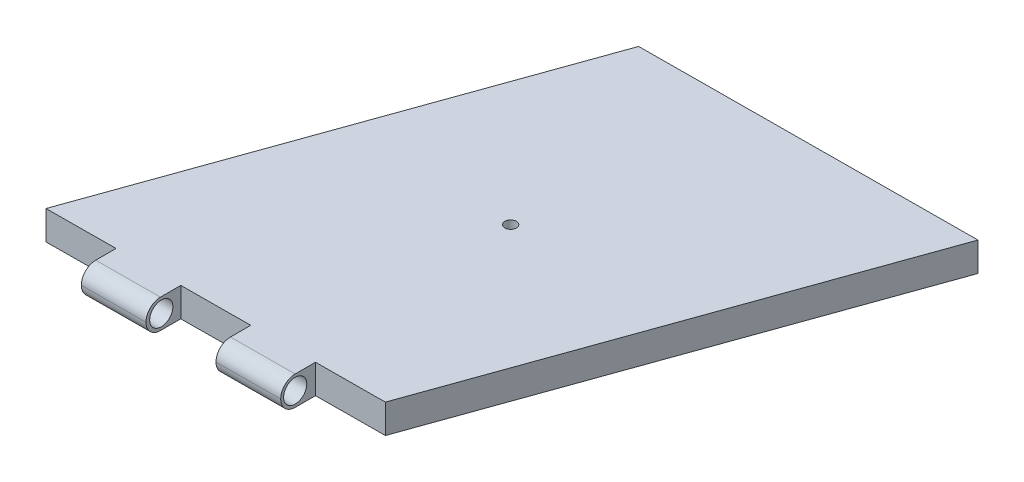
ISO-10303-21;
HEADER;
FILE_DESCRIPTION(('STEP AP214'),'2;1');
FILE_NAME('part.step','',(''),(''),'','','');
FILE_SCHEMA(('AUTOMOTIVE_DESIGN { 1 0 10303 214 1 1 1 1 }'));
ENDSEC;
DATA;
#1=APPLICATION_CONTEXT('core data for automotive mechanical design processes');
#2=APPLICATION_PROTOCOL_DEFINITION('international standard','automotive_design',2000,#1);
#3=PRODUCT_CONTEXT('',#1,'mechanical');
#4=PRODUCT('Part','Part','',(#3));
#5=PRODUCT_RELATED_PRODUCT_CATEGORY('part','',(#4));
#6=PRODUCT_DEFINITION_FORMATION('','',#4);
#7=PRODUCT_DEFINITION_CONTEXT('part definition',#1,'design');
#8=PRODUCT_DEFINITION('design','',#6,#7);
#9=PRODUCT_DEFINITION_SHAPE('','',#8);
#10=(LENGTH_UNIT() NAMED_UNIT(*) SI_UNIT(.MILLI.,.METRE.));
#11=(NAMED_UNIT(*) PLANE_ANGLE_UNIT() SI_UNIT($,.RADIAN.));
#12=(NAMED_UNIT(*) SI_UNIT($,.STERADIAN.) SOLID_ANGLE_UNIT());
#13=UNCERTAINTY_MEASURE_WITH_UNIT(LENGTH_MEASURE(1.E-05),#10,'distance_accuracy_value','');
#14=(GEOMETRIC_REPRESENTATION_CONTEXT(3) GLOBAL_UNCERTAINTY_ASSIGNED_CONTEXT((#13)) GLOBAL_UNIT_ASSIGNED_CONTEXT((#10,
#11,#12)) REPRESENTATION_CONTEXT('',''));
#15=CARTESIAN_POINT('',(0.,0.,0.));
#16=DIRECTION('',(0.,0.,1.));
#17=DIRECTION('',(1.,0.,0.));
#18=AXIS2_PLACEMENT_3D('',#15,#16,#17);
#19=CARTESIAN_POINT('',(0.,6.35,0.));
#20=DIRECTION('',(0.,1.,0.));
#21=DIRECTION('',(0.,0.,1.));
#22=AXIS2_PLACEMENT_3D('',#19,#20,#21);
#23=PLANE('',#22);
#24=CARTESIAN_POINT('',(53.9642285539041,6.35,-47.8401834952615));
#25=DIRECTION('',(0.,1.,0.));
#26=DIRECTION('',(0.,0.,1.));
#27=AXIS2_PLACEMENT_3D('',#24,#25,#26);
#28=CIRCLE('',#27,1.26999999999999);
#29=CARTESIAN_POINT('',(53.9642285539041,6.35,-46.5701834952615));
#30=VERTEX_POINT('',#29);
#31=EDGE_CURVE('E200',#30,#30,#28,.T.);
#32=ORIENTED_EDGE('',*,*,#31,.F.);
#33=EDGE_LOOP('',(#32));
#34=FACE_BOUND('',#33,.T.);
#35=DIRECTION('',(0.,0.,1.));
#36=VECTOR('',#35,1.);
#37=CARTESIAN_POINT('',(44.5947957554998,6.35,0.));
#38=LINE('',#37,#36);
#39=CARTESIAN_POINT('',(44.5947957554998,6.35,-0.268643347924703));
#40=VERTEX_POINT('',#39);
#41=CARTESIAN_POINT('',(44.5947957554998,6.35,4.17643730528465));
#42=VERTEX_POINT('',#41);
#43=EDGE_CURVE('E145',#40,#42,#38,.T.);
#44=ORIENTED_EDGE('',*,*,#43,.T.);
#45=DIRECTION('',(-0.999981855625208,0.,0.00602398708207968));
#46=VECTOR('',#45,1.);
#47=CARTESIAN_POINT('',(0.0267766225798442,6.35,4.44491934825405));
#48=LINE('',#47,#46);
#49=CARTESIAN_POINT('',(58.6931369153198,6.35,4.09150753926163));
#50=VERTEX_POINT('',#49);
#51=EDGE_CURVE('E243',#42,#50,#48,.F.);
#52=ORIENTED_EDGE('',*,*,#51,.T.);
#53=DIRECTION('',(0.,0.,1.));
#54=VECTOR('',#53,1.);
#55=CARTESIAN_POINT('',(58.6931369153198,6.35,0.));
#56=LINE('',#55,#54);
#57=CARTESIAN_POINT('',(58.6931369153198,6.35,-0.353573113947716));
#58=VERTEX_POINT('',#57);
#59=EDGE_CURVE('E160',#58,#50,#56,.T.);
#60=ORIENTED_EDGE('',*,*,#59,.F.);
#61=DIRECTION('',(0.999981855625208,0.,-0.00602398708207968));
#62=VECTOR('',#61,1.);
#63=CARTESIAN_POINT('',(0.,6.35,0.));
#64=LINE('',#63,#62);
#65=CARTESIAN_POINT('',(73.914,6.35,-0.445265060240972));
#66=VERTEX_POINT('',#65);
#67=EDGE_CURVE('E141',#58,#66,#64,.T.);
#68=ORIENTED_EDGE('',*,*,#67,.T.);
#69=DIRECTION('',(0.336353241375259,0.,-0.941735895576014));
#70=VECTOR('',#69,1.);
#71=CARTESIAN_POINT('',(73.914,6.35,-0.445265060240972));
#72=LINE('',#71,#70);
#73=CARTESIAN_POINT('',(108.087489323726,6.35,-96.125632050764));
#74=VERTEX_POINT('',#73);
#75=EDGE_CURVE('E206',#66,#74,#72,.T.);
#76=ORIENTED_EDGE('',*,*,#75,.T.);
#77=DIRECTION('',(-0.999981855625208,0.,0.00602398708207958));
#78=VECTOR('',#77,1.);
#79=CARTESIAN_POINT('',(34.1734893237263,6.35,-95.680366990523));
#80=LINE('',#79,#78);
#81=CARTESIAN_POINT('',(34.1734893237263,6.35,-95.680366990523));
#82=VERTEX_POINT('',#81);
#83=EDGE_CURVE('E208',#74,#82,#80,.T.);
#84=ORIENTED_EDGE('',*,*,#83,.T.);
#85=DIRECTION('',(-0.336353241375259,0.,0.941735895576014));
#86=VECTOR('',#85,1.);
#87=CARTESIAN_POINT('',(0.,6.35,0.));
#88=LINE('',#87,#86);
#89=CARTESIAN_POINT('',(0.,6.35,0.));
#90=VERTEX_POINT('',#89);
#91=EDGE_CURVE('E211',#82,#90,#88,.T.);
#92=ORIENTED_EDGE('',*,*,#91,.T.);
#93=DIRECTION('',(0.999981855625208,0.,-0.00602398708207968));
#94=VECTOR('',#93,1.);
#95=CARTESIAN_POINT('',(0.,6.35,0.));
#96=LINE('',#95,#94);
#97=CARTESIAN_POINT('',(15.2564545956798,6.35,-0.0919063529860246));
#98=VERTEX_POINT('',#97);
#99=EDGE_CURVE('E192',#90,#98,#96,.T.);
#100=ORIENTED_EDGE('',*,*,#99,.T.);
#101=DIRECTION('',(0.,0.,1.));
#102=VECTOR('',#101,1.);
#103=CARTESIAN_POINT('',(15.2564545956798,6.35,0.));
#104=LINE('',#103,#102);
#105=CARTESIAN_POINT('',(15.2564545956798,6.35,4.35317430022333));
#106=VERTEX_POINT('',#105);
#107=EDGE_CURVE('E187',#98,#106,#104,.T.);
#108=ORIENTED_EDGE('',*,*,#107,.T.);
#109=DIRECTION('',(-0.999981855625208,0.,0.00602398708207968));
#110=VECTOR('',#109,1.);
#111=CARTESIAN_POINT('',(0.0267766225798442,6.35,4.44491934825405));
#112=LINE('',#111,#110);
#113=CARTESIAN_POINT('',(29.3547957554998,6.35,4.26824453420031));
#114=VERTEX_POINT('',#113);
#115=EDGE_CURVE('E241',#106,#114,#112,.F.);
#116=ORIENTED_EDGE('',*,*,#115,.T.);
#117=DIRECTION('',(0.,0.,1.));
#118=VECTOR('',#117,1.);
#119=CARTESIAN_POINT('',(29.3547957554998,6.35,0.));
#120=LINE('',#119,#118);
#121=CARTESIAN_POINT('',(29.3547957554998,6.35,-0.176836119009038));
#122=VERTEX_POINT('',#121);
#123=EDGE_CURVE('E173',#122,#114,#120,.T.);
#124=ORIENTED_EDGE('',*,*,#123,.F.);
#125=DIRECTION('',(0.999981855625208,0.,-0.00602398708207968));
#126=VECTOR('',#125,1.);
#127=CARTESIAN_POINT('',(0.,6.35,0.));
#128=LINE('',#127,#126);
#129=EDGE_CURVE('E181',#122,#40,#128,.T.);
#130=ORIENTED_EDGE('',*,*,#129,.T.);
#131=EDGE_LOOP('',(#44,#52,#60,#68,#76,#84,#92,#100,#108,#116,#124,#130));
#132=FACE_BOUND('',#131,.T.);
#133=ADVANCED_FACE('F33',(#34,#132),#23,.T.);
#134=CARTESIAN_POINT('',(0.,0.,0.));
#135=DIRECTION('',(0.,1.,0.));
#136=DIRECTION('',(0.,0.,1.));
#137=AXIS2_PLACEMENT_3D('',#134,#135,#136);
#138=PLANE('',#137);
#139=CARTESIAN_POINT('',(53.9642285539041,0.,-47.8401834952615));
#140=DIRECTION('',(0.,1.,0.));
#141=DIRECTION('',(0.,0.,1.));
#142=AXIS2_PLACEMENT_3D('',#139,#140,#141);
#143=CIRCLE('',#142,1.26999999999999);
#144=CARTESIAN_POINT('',(53.9642285539041,0.,-46.5701834952615));
#145=VERTEX_POINT('',#144);
#146=EDGE_CURVE('E201',#145,#145,#143,.T.);
#147=ORIENTED_EDGE('',*,*,#146,.T.);
#148=EDGE_LOOP('',(#147));
#149=FACE_BOUND('',#148,.T.);
#150=DIRECTION('',(0.,0.,1.));
#151=VECTOR('',#150,1.);
#152=CARTESIAN_POINT('',(58.6931369153198,0.,0.));
#153=LINE('',#152,#151);
#154=CARTESIAN_POINT('',(58.6931369153198,0.,-0.353573113947716));
#155=VERTEX_POINT('',#154);
#156=CARTESIAN_POINT('',(58.6931369153198,0.,4.09150753926163));
#157=VERTEX_POINT('',#156);
#158=EDGE_CURVE('E146',#155,#157,#153,.T.);
#159=ORIENTED_EDGE('',*,*,#158,.T.);
#160=DIRECTION('',(0.999981855625208,0.,-0.00602398708207968));
#161=VECTOR('',#160,1.);
#162=CARTESIAN_POINT('',(44.5756695965142,0.,4.17655252310986));
#163=LINE('',#162,#161);
#164=CARTESIAN_POINT('',(44.5947957554998,0.,4.17643730528465));
#165=VERTEX_POINT('',#164);
#166=EDGE_CURVE('E235',#157,#165,#163,.F.);
#167=ORIENTED_EDGE('',*,*,#166,.T.);
#168=DIRECTION('',(0.,0.,1.));
#169=VECTOR('',#168,1.);
#170=CARTESIAN_POINT('',(44.5947957554998,0.,0.));
#171=LINE('',#170,#169);
#172=CARTESIAN_POINT('',(44.5947957554998,0.,-0.268643347924703));
#173=VERTEX_POINT('',#172);
#174=EDGE_CURVE('E169',#173,#165,#171,.T.);
#175=ORIENTED_EDGE('',*,*,#174,.F.);
#176=DIRECTION('',(0.999981855625208,0.,-0.00602398708207968));
#177=VECTOR('',#176,1.);
#178=CARTESIAN_POINT('',(0.,0.,0.));
#179=LINE('',#178,#177);
#180=CARTESIAN_POINT('',(29.3547957554998,0.,-0.176836119009038));
#181=VERTEX_POINT('',#180);
#182=EDGE_CURVE('E172',#181,#173,#179,.T.);
#183=ORIENTED_EDGE('',*,*,#182,.F.);
#184=DIRECTION('',(0.,0.,1.));
#185=VECTOR('',#184,1.);
#186=CARTESIAN_POINT('',(29.3547957554998,0.,0.));
#187=LINE('',#186,#185);
#188=CARTESIAN_POINT('',(29.3547957554998,0.,4.26824453420031));
#189=VERTEX_POINT('',#188);
#190=EDGE_CURVE('E175',#181,#189,#187,.T.);
#191=ORIENTED_EDGE('',*,*,#190,.T.);
#192=DIRECTION('',(0.999981855625208,0.,-0.00602398708207968));
#193=VECTOR('',#192,1.);
#194=CARTESIAN_POINT('',(15.2373284366942,0.,4.35328951804854));
#195=LINE('',#194,#193);
#196=CARTESIAN_POINT('',(15.2564545956798,0.,4.35317430022333));
#197=VERTEX_POINT('',#196);
#198=EDGE_CURVE('E232',#189,#197,#195,.F.);
#199=ORIENTED_EDGE('',*,*,#198,.T.);
#200=DIRECTION('',(0.,0.,1.));
#201=VECTOR('',#200,1.);
#202=CARTESIAN_POINT('',(15.2564545956798,0.,0.));
#203=LINE('',#202,#201);
#204=CARTESIAN_POINT('',(15.2564545956798,0.,-0.0919063529860246));
#205=VERTEX_POINT('',#204);
#206=EDGE_CURVE('E189',#205,#197,#203,.T.);
#207=ORIENTED_EDGE('',*,*,#206,.F.);
#208=DIRECTION('',(0.999981855625208,0.,-0.00602398708207968));
#209=VECTOR('',#208,1.);
#210=CARTESIAN_POINT('',(0.,0.,0.));
#211=LINE('',#210,#209);
#212=CARTESIAN_POINT('',(0.,0.,0.));
#213=VERTEX_POINT('',#212);
#214=EDGE_CURVE('E191',#213,#205,#211,.T.);
#215=ORIENTED_EDGE('',*,*,#214,.F.);
#216=DIRECTION('',(-0.336353241375259,0.,0.941735895576014));
#217=VECTOR('',#216,1.);
#218=CARTESIAN_POINT('',(0.,0.,0.));
#219=LINE('',#218,#217);
#220=CARTESIAN_POINT('',(34.1734893237263,0.,-95.680366990523));
#221=VERTEX_POINT('',#220);
#222=EDGE_CURVE('E209',#221,#213,#219,.T.);
#223=ORIENTED_EDGE('',*,*,#222,.F.);
#224=DIRECTION('',(-0.999981855625208,0.,0.00602398708207958));
#225=VECTOR('',#224,1.);
#226=CARTESIAN_POINT('',(34.1734893237263,0.,-95.680366990523));
#227=LINE('',#226,#225);
#228=CARTESIAN_POINT('',(108.087489323726,0.,-96.125632050764));
#229=VERTEX_POINT('',#228);
#230=EDGE_CURVE('E216',#229,#221,#227,.T.);
#231=ORIENTED_EDGE('',*,*,#230,.F.);
#232=DIRECTION('',(0.336353241375259,0.,-0.941735895576014));
#233=VECTOR('',#232,1.);
#234=CARTESIAN_POINT('',(73.914,0.,-0.445265060240972));
#235=LINE('',#234,#233);
#236=CARTESIAN_POINT('',(73.914,0.,-0.445265060240972));
#237=VERTEX_POINT('',#236);
#238=EDGE_CURVE('E158',#237,#229,#235,.T.);
#239=ORIENTED_EDGE('',*,*,#238,.F.);
#240=DIRECTION('',(0.999981855625208,0.,-0.00602398708207968));
#241=VECTOR('',#240,1.);
#242=CARTESIAN_POINT('',(0.,0.,0.));
#243=LINE('',#242,#241);
#244=EDGE_CURVE('E138',#155,#237,#243,.T.);
#245=ORIENTED_EDGE('',*,*,#244,.F.);
#246=EDGE_LOOP('',(#159,#167,#175,#183,#191,#199,#207,#215,#223,#231,#239,#245));
#247=FACE_BOUND('',#246,.T.);
#248=ADVANCED_FACE('F156',(#149,#247),#138,.F.);
#249=CARTESIAN_POINT('',(73.914,6.35,-0.445265060240972));
#250=DIRECTION('',(-0.941735895576014,0.,-0.336353241375259));
#251=DIRECTION('',(-0.336353241375259,0.,0.941735895576014));
#252=AXIS2_PLACEMENT_3D('',#249,#250,#251);
#253=PLANE('',#252);
#254=ORIENTED_EDGE('',*,*,#238,.T.);
#255=DIRECTION('',(0.,-1.,0.));
#256=VECTOR('',#255,1.);
#257=CARTESIAN_POINT('',(108.087489323726,6.35,-96.125632050764));
#258=LINE('',#257,#256);
#259=EDGE_CURVE('E224',#74,#229,#258,.T.);
#260=ORIENTED_EDGE('',*,*,#259,.F.);
#261=ORIENTED_EDGE('',*,*,#75,.F.);
#262=DIRECTION('',(0.,-1.,0.));
#263=VECTOR('',#262,1.);
#264=CARTESIAN_POINT('',(73.914,6.35,-0.445265060240972));
#265=LINE('',#264,#263);
#266=EDGE_CURVE('E227',#66,#237,#265,.T.);
#267=ORIENTED_EDGE('',*,*,#266,.T.);
#268=EDGE_LOOP('',(#254,#260,#261,#267));
#269=FACE_BOUND('',#268,.T.);
#270=ADVANCED_FACE('F290',(#269),#253,.F.);
#271=CARTESIAN_POINT('',(34.1734893237263,6.35,-95.680366990523));
#272=DIRECTION('',(0.00602398708207958,0.,0.999981855625208));
#273=DIRECTION('',(0.999981855625208,0.,-0.00602398708207959));
#274=AXIS2_PLACEMENT_3D('',#271,#272,#273);
#275=PLANE('',#274);
#276=ORIENTED_EDGE('',*,*,#230,.T.);
#277=DIRECTION('',(0.,-1.,0.));
#278=VECTOR('',#277,1.);
#279=CARTESIAN_POINT('',(34.1734893237263,6.35,-95.680366990523));
#280=LINE('',#279,#278);
#281=EDGE_CURVE('E221',#82,#221,#280,.T.);
#282=ORIENTED_EDGE('',*,*,#281,.F.);
#283=ORIENTED_EDGE('',*,*,#83,.F.);
#284=ORIENTED_EDGE('',*,*,#259,.T.);
#285=EDGE_LOOP('',(#276,#282,#283,#284));
#286=FACE_BOUND('',#285,.T.);
#287=ADVANCED_FACE('F302',(#286),#275,.F.);
#288=CARTESIAN_POINT('',(0.,6.35,0.));
#289=DIRECTION('',(0.941735895576014,0.,0.336353241375259));
#290=DIRECTION('',(0.336353241375259,0.,-0.941735895576014));
#291=AXIS2_PLACEMENT_3D('',#288,#289,#290);
#292=PLANE('',#291);
#293=ORIENTED_EDGE('',*,*,#222,.T.);
#294=DIRECTION('',(0.,-1.,0.));
#295=VECTOR('',#294,1.);
#296=CARTESIAN_POINT('',(0.,6.35,0.));
#297=LINE('',#296,#295);
#298=EDGE_CURVE('E214',#90,#213,#297,.T.);
#299=ORIENTED_EDGE('',*,*,#298,.F.);
#300=ORIENTED_EDGE('',*,*,#91,.F.);
#301=ORIENTED_EDGE('',*,*,#281,.T.);
#302=EDGE_LOOP('',(#293,#299,#300,#301));
#303=FACE_BOUND('',#302,.T.);
#304=ADVANCED_FACE('F299',(#303),#292,.F.);
#305=CARTESIAN_POINT('',(53.9642285539041,0.,-47.8401834952615));
#306=DIRECTION('',(0.,1.,0.));
#307=DIRECTION('',(0.,0.,1.));
#308=AXIS2_PLACEMENT_3D('',#305,#306,#307);
#309=CYLINDRICAL_SURFACE('',#308,1.26999999999999);
#310=ORIENTED_EDGE('',*,*,#146,.F.);
#311=EDGE_LOOP('',(#310));
#312=FACE_BOUND('',#311,.T.);
#313=ORIENTED_EDGE('',*,*,#31,.T.);
#314=EDGE_LOOP('',(#313));
#315=FACE_BOUND('',#314,.T.);
#316=ADVANCED_FACE('F296',(#312,#315),#309,.F.);
#317=CARTESIAN_POINT('',(15.2564545956798,0.,0.));
#318=DIRECTION('',(-1.,0.,0.));
#319=DIRECTION('',(0.,0.,1.));
#320=AXIS2_PLACEMENT_3D('',#317,#318,#319);
#321=PLANE('',#320);
#322=CARTESIAN_POINT('',(15.2564545956798,3.175,4.09150753926165));
#323=DIRECTION('',(-1.,0.,0.));
#324=DIRECTION('',(0.,0.,1.));
#325=AXIS2_PLACEMENT_3D('',#322,#323,#324);
#326=CIRCLE('',#325,2.54);
#327=CARTESIAN_POINT('',(15.2564545956798,3.175,1.55150753926165));
#328=VERTEX_POINT('',#327);
#329=EDGE_CURVE('E164',#328,#328,#326,.T.);
#330=ORIENTED_EDGE('',*,*,#329,.F.);
#331=EDGE_LOOP('',(#330));
#332=FACE_BOUND('',#331,.T.);
#333=ORIENTED_EDGE('',*,*,#206,.T.);
#334=CARTESIAN_POINT('',(15.2564545956798,3.175,4.35317430022333));
#335=DIRECTION('',(-1.,0.,0.));
#336=DIRECTION('',(0.,0.,1.));
#337=AXIS2_PLACEMENT_3D('',#334,#335,#336);
#338=ELLIPSE('',#337,3.17505760943525,3.175);
#339=CARTESIAN_POINT('',(15.2564545956798,3.175,7.52823190965858));
#340=VERTEX_POINT('',#339);
#341=EDGE_CURVE('E11',#197,#340,#338,.T.);
#342=ORIENTED_EDGE('',*,*,#341,.T.);
#343=CARTESIAN_POINT('',(15.2564545956798,3.175,4.35317430022333));
#344=DIRECTION('',(-1.,0.,0.));
#345=DIRECTION('',(0.,0.,1.));
#346=AXIS2_PLACEMENT_3D('',#343,#344,#345);
#347=ELLIPSE('',#346,3.17505760943525,3.175);
#348=EDGE_CURVE('E42',#340,#106,#347,.T.);
#349=ORIENTED_EDGE('',*,*,#348,.T.);
#350=ORIENTED_EDGE('',*,*,#107,.F.);
#351=DIRECTION('',(0.,1.,0.));
#352=VECTOR('',#351,1.);
#353=CARTESIAN_POINT('',(15.2564545956798,0.,-0.0919063529860246));
#354=LINE('',#353,#352);
#355=EDGE_CURVE('E194',#205,#98,#354,.T.);
#356=ORIENTED_EDGE('',*,*,#355,.F.);
#357=EDGE_LOOP('',(#333,#342,#349,#350,#356));
#358=FACE_BOUND('',#357,.T.);
#359=ADVANCED_FACE('F325',(#332,#358),#321,.T.);
#360=CARTESIAN_POINT('',(0.,0.,0.));
#361=DIRECTION('',(0.00602398708207968,0.,0.999981855625208));
#362=DIRECTION('',(0.999981855625208,0.,-0.00602398708207968));
#363=AXIS2_PLACEMENT_3D('',#360,#361,#362);
#364=PLANE('',#363);
#365=ORIENTED_EDGE('',*,*,#99,.F.);
#366=ORIENTED_EDGE('',*,*,#298,.T.);
#367=ORIENTED_EDGE('',*,*,#214,.T.);
#368=ORIENTED_EDGE('',*,*,#355,.T.);
#369=EDGE_LOOP('',(#365,#366,#367,#368));
#370=FACE_BOUND('',#369,.T.);
#371=ADVANCED_FACE('F328',(#370),#364,.T.);
#372=CARTESIAN_POINT('',(44.5947957554998,0.,0.));
#373=DIRECTION('',(-1.,0.,0.));
#374=DIRECTION('',(0.,0.,1.));
#375=AXIS2_PLACEMENT_3D('',#372,#373,#374);
#376=PLANE('',#375);
#377=CARTESIAN_POINT('',(44.5947957554998,3.175,4.09150753926165));
#378=DIRECTION('',(-1.,0.,0.));
#379=DIRECTION('',(0.,0.,1.));
#380=AXIS2_PLACEMENT_3D('',#377,#378,#379);
#381=CIRCLE('',#380,2.54);
#382=CARTESIAN_POINT('',(44.5947957554998,3.175,1.55150753926165));
#383=VERTEX_POINT('',#382);
#384=EDGE_CURVE('E255',#383,#383,#381,.T.);
#385=ORIENTED_EDGE('',*,*,#384,.F.);
#386=EDGE_LOOP('',(#385));
#387=FACE_BOUND('',#386,.T.);
#388=ORIENTED_EDGE('',*,*,#174,.T.);
#389=CARTESIAN_POINT('',(44.5947957554998,3.175,4.17643730528465));
#390=DIRECTION('',(-1.,0.,0.));
#391=DIRECTION('',(0.,0.,1.));
#392=AXIS2_PLACEMENT_3D('',#389,#390,#391);
#393=ELLIPSE('',#392,3.17505760943525,3.175);
#394=CARTESIAN_POINT('',(44.5947957554998,3.175,7.3514949147199));
#395=VERTEX_POINT('',#394);
#396=EDGE_CURVE('E239',#165,#395,#393,.T.);
#397=ORIENTED_EDGE('',*,*,#396,.T.);
#398=CARTESIAN_POINT('',(44.5947957554998,3.175,4.17643730528465));
#399=DIRECTION('',(-1.,0.,0.));
#400=DIRECTION('',(0.,0.,1.));
#401=AXIS2_PLACEMENT_3D('',#398,#399,#400);
#402=ELLIPSE('',#401,3.17505760943525,3.175);
#403=EDGE_CURVE('E237',#395,#42,#402,.T.);
#404=ORIENTED_EDGE('',*,*,#403,.T.);
#405=ORIENTED_EDGE('',*,*,#43,.F.);
#406=DIRECTION('',(0.,1.,0.));
#407=VECTOR('',#406,1.);
#408=CARTESIAN_POINT('',(44.5947957554998,0.,-0.268643347924703));
#409=LINE('',#408,#407);
#410=EDGE_CURVE('E178',#173,#40,#409,.T.);
#411=ORIENTED_EDGE('',*,*,#410,.F.);
#412=EDGE_LOOP('',(#388,#397,#404,#405,#411));
#413=FACE_BOUND('',#412,.T.);
#414=ADVANCED_FACE('F342',(#387,#413),#376,.T.);
#415=CARTESIAN_POINT('',(29.3547957554998,0.,0.));
#416=DIRECTION('',(-1.,0.,0.));
#417=DIRECTION('',(0.,0.,1.));
#418=AXIS2_PLACEMENT_3D('',#415,#416,#417);
#419=PLANE('',#418);
#420=CARTESIAN_POINT('',(29.3547957554998,3.175,4.09150753926165));
#421=DIRECTION('',(-1.,0.,0.));
#422=DIRECTION('',(0.,0.,1.));
#423=AXIS2_PLACEMENT_3D('',#420,#421,#422);
#424=CIRCLE('',#423,2.54);
#425=CARTESIAN_POINT('',(29.3547957554998,3.175,1.55150753926165));
#426=VERTEX_POINT('',#425);
#427=EDGE_CURVE('E259',#426,#426,#424,.T.);
#428=ORIENTED_EDGE('',*,*,#427,.T.);
#429=EDGE_LOOP('',(#428));
#430=FACE_BOUND('',#429,.T.);
#431=CARTESIAN_POINT('',(29.3547957554998,3.175,4.26824453420031));
#432=DIRECTION('',(-1.,0.,0.));
#433=DIRECTION('',(0.,0.,1.));
#434=AXIS2_PLACEMENT_3D('',#431,#432,#433);
#435=ELLIPSE('',#434,3.17505760943525,3.175);
#436=CARTESIAN_POINT('',(29.3547957554998,3.175,7.44330214363556));
#437=VERTEX_POINT('',#436);
#438=EDGE_CURVE('E56',#114,#437,#435,.F.);
#439=ORIENTED_EDGE('',*,*,#438,.T.);
#440=CARTESIAN_POINT('',(29.3547957554998,3.175,4.26824453420031));
#441=DIRECTION('',(-1.,0.,0.));
#442=DIRECTION('',(0.,0.,1.));
#443=AXIS2_PLACEMENT_3D('',#440,#441,#442);
#444=ELLIPSE('',#443,3.17505760943525,3.175);
#445=EDGE_CURVE('E246',#437,#189,#444,.F.);
#446=ORIENTED_EDGE('',*,*,#445,.T.);
#447=ORIENTED_EDGE('',*,*,#190,.F.);
#448=DIRECTION('',(0.,1.,0.));
#449=VECTOR('',#448,1.);
#450=CARTESIAN_POINT('',(29.3547957554998,0.,-0.176836119009038));
#451=LINE('',#450,#449);
#452=EDGE_CURVE('E185',#181,#122,#451,.T.);
#453=ORIENTED_EDGE('',*,*,#452,.T.);
#454=ORIENTED_EDGE('',*,*,#123,.T.);
#455=EDGE_LOOP('',(#439,#446,#447,#453,#454));
#456=FACE_BOUND('',#455,.T.);
#457=ADVANCED_FACE('F347',(#430,#456),#419,.F.);
#458=CARTESIAN_POINT('',(0.,0.,0.));
#459=DIRECTION('',(0.00602398708207968,0.,0.999981855625208));
#460=DIRECTION('',(0.999981855625208,0.,-0.00602398708207968));
#461=AXIS2_PLACEMENT_3D('',#458,#459,#460);
#462=PLANE('',#461);
#463=ORIENTED_EDGE('',*,*,#129,.F.);
#464=ORIENTED_EDGE('',*,*,#452,.F.);
#465=ORIENTED_EDGE('',*,*,#182,.T.);
#466=ORIENTED_EDGE('',*,*,#410,.T.);
#467=EDGE_LOOP('',(#463,#464,#465,#466));
#468=FACE_BOUND('',#467,.T.);
#469=ADVANCED_FACE('F281',(#468),#462,.T.);
#470=CARTESIAN_POINT('',(0.,0.,0.));
#471=DIRECTION('',(0.00602398708207968,0.,0.999981855625208));
#472=DIRECTION('',(0.999981855625208,0.,-0.00602398708207968));
#473=AXIS2_PLACEMENT_3D('',#470,#471,#472);
#474=PLANE('',#473);
#475=ORIENTED_EDGE('',*,*,#67,.F.);
#476=DIRECTION('',(0.,1.,0.));
#477=VECTOR('',#476,1.);
#478=CARTESIAN_POINT('',(58.6931369153198,0.,-0.353573113947716));
#479=LINE('',#478,#477);
#480=EDGE_CURVE('E134',#155,#58,#479,.T.);
#481=ORIENTED_EDGE('',*,*,#480,.F.);
#482=ORIENTED_EDGE('',*,*,#244,.T.);
#483=ORIENTED_EDGE('',*,*,#266,.F.);
#484=EDGE_LOOP('',(#475,#481,#482,#483));
#485=FACE_BOUND('',#484,.T.);
#486=ADVANCED_FACE('F136',(#485),#474,.T.);
#487=CARTESIAN_POINT('',(58.6931369153198,0.,0.));
#488=DIRECTION('',(-1.,0.,0.));
#489=DIRECTION('',(0.,0.,1.));
#490=AXIS2_PLACEMENT_3D('',#487,#488,#489);
#491=PLANE('',#490);
#492=CARTESIAN_POINT('',(58.6931369153198,3.175,4.09150753926165));
#493=DIRECTION('',(1.,0.,0.));
#494=DIRECTION('',(0.,0.,-1.));
#495=AXIS2_PLACEMENT_3D('',#492,#493,#494);
#496=CIRCLE('',#495,2.54);
#497=CARTESIAN_POINT('',(58.6931369153198,3.175,1.55150753926165));
#498=VERTEX_POINT('',#497);
#499=EDGE_CURVE('E263',#498,#498,#496,.T.);
#500=ORIENTED_EDGE('',*,*,#499,.F.);
#501=EDGE_LOOP('',(#500));
#502=FACE_BOUND('',#501,.T.);
#503=CARTESIAN_POINT('',(58.6931369153198,3.175,4.09150753926163));
#504=DIRECTION('',(-1.,0.,0.));
#505=DIRECTION('',(0.,0.,1.));
#506=AXIS2_PLACEMENT_3D('',#503,#504,#505);
#507=ELLIPSE('',#506,3.17505760943525,3.175);
#508=CARTESIAN_POINT('',(58.6931369153198,3.175,7.26656514869689));
#509=VERTEX_POINT('',#508);
#510=EDGE_CURVE('E229',#50,#509,#507,.F.);
#511=ORIENTED_EDGE('',*,*,#510,.T.);
#512=CARTESIAN_POINT('',(58.6931369153198,3.175,4.09150753926163));
#513=DIRECTION('',(-1.,0.,0.));
#514=DIRECTION('',(0.,0.,1.));
#515=AXIS2_PLACEMENT_3D('',#512,#513,#514);
#516=ELLIPSE('',#515,3.17505760943525,3.175);
#517=EDGE_CURVE('E151',#509,#157,#516,.F.);
#518=ORIENTED_EDGE('',*,*,#517,.T.);
#519=ORIENTED_EDGE('',*,*,#158,.F.);
#520=ORIENTED_EDGE('',*,*,#480,.T.);
#521=ORIENTED_EDGE('',*,*,#59,.T.);
#522=EDGE_LOOP('',(#511,#518,#519,#520,#521));
#523=FACE_BOUND('',#522,.T.);
#524=ADVANCED_FACE('F149',(#502,#523),#491,.F.);
#525=CARTESIAN_POINT('',(0.0267766225798442,3.175,4.44491934825405));
#526=DIRECTION('',(-0.999981855625208,0.,0.00602398708207968));
#527=DIRECTION('',(0.00602398708207968,0.,0.999981855625208));
#528=AXIS2_PLACEMENT_3D('',#525,#526,#527);
#529=CYLINDRICAL_SURFACE('',#528,3.175);
#530=ORIENTED_EDGE('',*,*,#51,.F.);
#531=ORIENTED_EDGE('',*,*,#403,.F.);
#532=DIRECTION('',(-0.999981855625208,0.,0.00602398708207968));
#533=VECTOR('',#532,1.);
#534=CARTESIAN_POINT('',(0.0459027815654472,3.175,7.61986173986409));
#535=LINE('',#534,#533);
#536=EDGE_CURVE('E167',#509,#395,#535,.T.);
#537=ORIENTED_EDGE('',*,*,#536,.F.);
#538=ORIENTED_EDGE('',*,*,#510,.F.);
#539=EDGE_LOOP('',(#530,#531,#537,#538));
#540=FACE_BOUND('',#539,.T.);
#541=ADVANCED_FACE('F272',(#540),#529,.T.);
#542=CARTESIAN_POINT('',(0.0267766225798442,3.175,4.44491934825405));
#543=DIRECTION('',(-0.999981855625208,0.,0.00602398708207968));
#544=DIRECTION('',(0.00602398708207968,0.,0.999981855625208));
#545=AXIS2_PLACEMENT_3D('',#542,#543,#544);
#546=CYLINDRICAL_SURFACE('',#545,3.175);
#547=ORIENTED_EDGE('',*,*,#396,.F.);
#548=ORIENTED_EDGE('',*,*,#166,.F.);
#549=ORIENTED_EDGE('',*,*,#517,.F.);
#550=ORIENTED_EDGE('',*,*,#536,.T.);
#551=EDGE_LOOP('',(#547,#548,#549,#550));
#552=FACE_BOUND('',#551,.T.);
#553=ADVANCED_FACE('F278',(#552),#546,.T.);
#554=CARTESIAN_POINT('',(0.0267766225798442,3.175,4.44491934825405));
#555=DIRECTION('',(-0.999981855625208,0.,0.00602398708207968));
#556=DIRECTION('',(0.00602398708207968,0.,0.999981855625208));
#557=AXIS2_PLACEMENT_3D('',#554,#555,#556);
#558=CYLINDRICAL_SURFACE('',#557,3.175);
#559=ORIENTED_EDGE('',*,*,#115,.F.);
#560=ORIENTED_EDGE('',*,*,#348,.F.);
#561=DIRECTION('',(-0.999981855625208,0.,0.00602398708207968));
#562=VECTOR('',#561,1.);
#563=CARTESIAN_POINT('',(0.0459027815654472,3.175,7.61986173986409));
#564=LINE('',#563,#562);
#565=EDGE_CURVE('E37',#437,#340,#564,.T.);
#566=ORIENTED_EDGE('',*,*,#565,.F.);
#567=ORIENTED_EDGE('',*,*,#438,.F.);
#568=EDGE_LOOP('',(#559,#560,#566,#567));
#569=FACE_BOUND('',#568,.T.);
#570=ADVANCED_FACE('F35',(#569),#558,.T.);
#571=CARTESIAN_POINT('',(0.0267766225798442,3.175,4.44491934825405));
#572=DIRECTION('',(-0.999981855625208,0.,0.00602398708207968));
#573=DIRECTION('',(0.00602398708207968,0.,0.999981855625208));
#574=AXIS2_PLACEMENT_3D('',#571,#572,#573);
#575=CYLINDRICAL_SURFACE('',#574,3.175);
#576=ORIENTED_EDGE('',*,*,#341,.F.);
#577=ORIENTED_EDGE('',*,*,#198,.F.);
#578=ORIENTED_EDGE('',*,*,#445,.F.);
#579=ORIENTED_EDGE('',*,*,#565,.T.);
#580=EDGE_LOOP('',(#576,#577,#578,#579));
#581=FACE_BOUND('',#580,.T.);
#582=ADVANCED_FACE('F311',(#581),#575,.T.);
#583=CARTESIAN_POINT('',(0.,3.175,4.09150753926165));
#584=DIRECTION('',(1.,0.,0.));
#585=DIRECTION('',(0.,0.,-1.));
#586=AXIS2_PLACEMENT_3D('',#583,#584,#585);
#587=CYLINDRICAL_SURFACE('',#586,2.54);
#588=CARTESIAN_POINT('',(44.5947957554998,3.175,1.55150753926165));
#589=CARTESIAN_POINT('',(44.7416534759146,3.175,1.55150753926165));
#590=CARTESIAN_POINT('',(44.8885111963294,3.175,1.55150753926165));
#591=CARTESIAN_POINT('',(45.182226637159,3.175,1.55150753926165));
#592=CARTESIAN_POINT('',(45.3290843575738,3.175,1.55150753926165));
#593=CARTESIAN_POINT('',(45.6227997984034,3.175,1.55150753926165));
#594=CARTESIAN_POINT('',(45.7696575188182,3.175,1.55150753926165));
#595=CARTESIAN_POINT('',(46.0633729596477,3.175,1.55150753926165));
#596=CARTESIAN_POINT('',(46.2102306800625,3.175,1.55150753926165));
#597=CARTESIAN_POINT('',(46.5039461208921,3.175,1.55150753926165));
#598=CARTESIAN_POINT('',(46.6508038413069,3.175,1.55150753926165));
#599=CARTESIAN_POINT('',(46.9445192821365,3.175,1.55150753926165));
#600=CARTESIAN_POINT('',(47.0913770025513,3.175,1.55150753926165));
#601=CARTESIAN_POINT('',(47.3850924433809,3.175,1.55150753926165));
#602=CARTESIAN_POINT('',(47.5319501637957,3.175,1.55150753926165));
#603=CARTESIAN_POINT('',(47.8256656046252,3.175,1.55150753926165));
#604=CARTESIAN_POINT('',(47.97252332504,3.175,1.55150753926165));
#605=CARTESIAN_POINT('',(48.2662387658696,3.175,1.55150753926165));
#606=CARTESIAN_POINT('',(48.4130964862844,3.175,1.55150753926165));
#607=CARTESIAN_POINT('',(48.706811927114,3.175,1.55150753926165));
#608=CARTESIAN_POINT('',(48.8536696475288,3.175,1.55150753926165));
#609=CARTESIAN_POINT('',(49.1473850883584,3.175,1.55150753926165));
#610=CARTESIAN_POINT('',(49.2942428087732,3.175,1.55150753926165));
#611=CARTESIAN_POINT('',(49.5879582496027,3.175,1.55150753926165));
#612=CARTESIAN_POINT('',(49.7348159700175,3.175,1.55150753926165));
#613=CARTESIAN_POINT('',(50.0285314108471,3.175,1.55150753926165));
#614=CARTESIAN_POINT('',(50.1753891312619,3.175,1.55150753926165));
#615=CARTESIAN_POINT('',(50.4691045720915,3.175,1.55150753926165));
#616=CARTESIAN_POINT('',(50.6159622925063,3.175,1.55150753926165));
#617=CARTESIAN_POINT('',(50.9096777333359,3.175,1.55150753926165));
#618=CARTESIAN_POINT('',(51.0565354537507,3.175,1.55150753926165));
#619=CARTESIAN_POINT('',(51.3502508945802,3.175,1.55150753926165));
#620=CARTESIAN_POINT('',(51.497108614995,3.175,1.55150753926165));
#621=CARTESIAN_POINT('',(51.7908240558246,3.175,1.55150753926165));
#622=CARTESIAN_POINT('',(51.9376817762394,3.175,1.55150753926165));
#623=CARTESIAN_POINT('',(52.231397217069,3.175,1.55150753926165));
#624=CARTESIAN_POINT('',(52.3782549374838,3.175,1.55150753926165));
#625=CARTESIAN_POINT('',(52.6719703783134,3.175,1.55150753926165));
#626=CARTESIAN_POINT('',(52.8188280987282,3.175,1.55150753926165));
#627=CARTESIAN_POINT('',(53.1125435395577,3.175,1.55150753926165));
#628=CARTESIAN_POINT('',(53.2594012599725,3.175,1.55150753926165));
#629=CARTESIAN_POINT('',(53.5531167008021,3.175,1.55150753926165));
#630=CARTESIAN_POINT('',(53.6999744212169,3.175,1.55150753926165));
#631=CARTESIAN_POINT('',(53.9936898620465,3.175,1.55150753926165));
#632=CARTESIAN_POINT('',(54.1405475824613,3.175,1.55150753926165));
#633=CARTESIAN_POINT('',(54.4342630232909,3.175,1.55150753926165));
#634=CARTESIAN_POINT('',(54.5811207437057,3.175,1.55150753926165));
#635=CARTESIAN_POINT('',(54.8748361845352,3.175,1.55150753926165));
#636=CARTESIAN_POINT('',(55.02169390495,3.175,1.55150753926165));
#637=CARTESIAN_POINT('',(55.3154093457796,3.175,1.55150753926165));
#638=CARTESIAN_POINT('',(55.4622670661944,3.175,1.55150753926165));
#639=CARTESIAN_POINT('',(55.755982507024,3.175,1.55150753926165));
#640=CARTESIAN_POINT('',(55.9028402274388,3.175,1.55150753926165));
#641=CARTESIAN_POINT('',(56.1965556682684,3.175,1.55150753926165));
#642=CARTESIAN_POINT('',(56.3434133886832,3.175,1.55150753926165));
#643=CARTESIAN_POINT('',(56.6371288295127,3.175,1.55150753926165));
#644=CARTESIAN_POINT('',(56.7839865499275,3.175,1.55150753926165));
#645=CARTESIAN_POINT('',(57.0777019907571,3.175,1.55150753926165));
#646=CARTESIAN_POINT('',(57.2245597111719,3.175,1.55150753926165));
#647=CARTESIAN_POINT('',(57.5182751520015,3.175,1.55150753926165));
#648=CARTESIAN_POINT('',(57.6651328724163,3.175,1.55150753926165));
#649=CARTESIAN_POINT('',(57.9588483132459,3.175,1.55150753926165));
#650=CARTESIAN_POINT('',(58.1057060336607,3.175,1.55150753926165));
#651=CARTESIAN_POINT('',(58.3994214744902,3.175,1.55150753926165));
#652=CARTESIAN_POINT('',(58.546279194905,3.175,1.55150753926165));
#653=CARTESIAN_POINT('',(58.6931369153198,3.175,1.55150753926165));
#654=B_SPLINE_CURVE_WITH_KNOTS('',3,(#588,#589,#590,#591,#592,#593,#594,#595,#596,#597,#598,
#599,#600,#601,#602,#603,#604,#605,#606,#607,#608,#609,#610,#611,#612,#613,#614,#615,#616,#617,
#618,#619,#620,#621,#622,#623,#624,#625,#626,#627,#628,#629,#630,#631,#632,#633,#634,#635,#636,
#637,#638,#639,#640,#641,#642,#643,#644,#645,#646,#647,#648,#649,#650,#651,#652,#653),
.UNSPECIFIED.,.F.,.F.,(4,2,2,2,2,2,2,2,2,2,2,2,2,2,2,2,2,2,2,2,2,2,2,2,2,2,2,2,2,2,2,2,4),(0.,
0.440573161244379,0.88114632248875,1.32171948373313,1.7622926449775,2.20286580622188,
2.64343896746625,3.08401212871063,3.524585289955,3.96515845119938,4.40573161244376,
4.84630477368813,5.28687793493251,5.72745109617688,6.16802425742126,6.60859741866564,
7.04917057991001,7.48974374115438,7.93031690239876,8.37089006364314,8.81146322488751,
9.25203638613189,9.69260954737626,10.1331827086206,10.573755869865,11.0143290311094,
11.4549021923538,11.8954753535981,12.3360485148425,12.7766216760869,13.2171948373313,
13.6577679985756,14.09834115982),.UNSPECIFIED.);
#655=EDGE_CURVE('BSEAM269',#383,#498,#654,.T.);
#656=ORIENTED_EDGE('',*,*,#384,.T.);
#657=ORIENTED_EDGE('',*,*,#499,.T.);
#658=ORIENTED_EDGE('',*,*,#655,.T.);
#659=ORIENTED_EDGE('',*,*,#655,.F.);
#660=EDGE_LOOP('',(#656,#658,#657,#659));
#661=FACE_BOUND('',#660,.T.);
#662=ADVANCED_FACE('F269',(#661),#587,.F.);
#663=CARTESIAN_POINT('',(15.2564545956798,3.175,1.55150753926165));
#664=CARTESIAN_POINT('',(15.4033123160946,3.175,1.55150753926165));
#665=CARTESIAN_POINT('',(15.5501700365094,3.175,1.55150753926165));
#666=CARTESIAN_POINT('',(15.843885477339,3.175,1.55150753926165));
#667=CARTESIAN_POINT('',(15.9907431977538,3.175,1.55150753926165));
#668=CARTESIAN_POINT('',(16.2844586385833,3.175,1.55150753926165));
#669=CARTESIAN_POINT('',(16.4313163589981,3.175,1.55150753926165));
#670=CARTESIAN_POINT('',(16.7250317998277,3.175,1.55150753926165));
#671=CARTESIAN_POINT('',(16.8718895202425,3.175,1.55150753926165));
#672=CARTESIAN_POINT('',(17.1656049610721,3.175,1.55150753926165));
#673=CARTESIAN_POINT('',(17.3124626814869,3.175,1.55150753926165));
#674=CARTESIAN_POINT('',(17.6061781223165,3.175,1.55150753926165));
#675=CARTESIAN_POINT('',(17.7530358427313,3.175,1.55150753926165));
#676=CARTESIAN_POINT('',(18.0467512835608,3.175,1.55150753926165));
#677=CARTESIAN_POINT('',(18.1936090039756,3.175,1.55150753926165));
#678=CARTESIAN_POINT('',(18.4873244448052,3.175,1.55150753926165));
#679=CARTESIAN_POINT('',(18.63418216522,3.175,1.55150753926165));
#680=CARTESIAN_POINT('',(18.9278976060496,3.175,1.55150753926165));
#681=CARTESIAN_POINT('',(19.0747553264644,3.175,1.55150753926165));
#682=CARTESIAN_POINT('',(19.368470767294,3.175,1.55150753926165));
#683=CARTESIAN_POINT('',(19.5153284877088,3.175,1.55150753926165));
#684=CARTESIAN_POINT('',(19.8090439285383,3.175,1.55150753926165));
#685=CARTESIAN_POINT('',(19.9559016489531,3.175,1.55150753926165));
#686=CARTESIAN_POINT('',(20.2496170897827,3.175,1.55150753926165));
#687=CARTESIAN_POINT('',(20.3964748101975,3.175,1.55150753926165));
#688=CARTESIAN_POINT('',(20.6901902510271,3.175,1.55150753926165));
#689=CARTESIAN_POINT('',(20.8370479714419,3.175,1.55150753926165));
#690=CARTESIAN_POINT('',(21.1307634122715,3.175,1.55150753926165));
#691=CARTESIAN_POINT('',(21.2776211326863,3.175,1.55150753926165));
#692=CARTESIAN_POINT('',(21.5713365735159,3.175,1.55150753926165));
#693=CARTESIAN_POINT('',(21.7181942939306,3.175,1.55150753926165));
#694=CARTESIAN_POINT('',(22.0119097347602,3.175,1.55150753926165));
#695=CARTESIAN_POINT('',(22.158767455175,3.175,1.55150753926165));
#696=CARTESIAN_POINT('',(22.4524828960046,3.175,1.55150753926165));
#697=CARTESIAN_POINT('',(22.5993406164194,3.175,1.55150753926165));
#698=CARTESIAN_POINT('',(22.893056057249,3.175,1.55150753926165));
#699=CARTESIAN_POINT('',(23.0399137776638,3.175,1.55150753926165));
#700=CARTESIAN_POINT('',(23.3336292184934,3.175,1.55150753926165));
#701=CARTESIAN_POINT('',(23.4804869389081,3.175,1.55150753926165));
#702=CARTESIAN_POINT('',(23.7742023797377,3.175,1.55150753926165));
#703=CARTESIAN_POINT('',(23.9210601001525,3.175,1.55150753926165));
#704=CARTESIAN_POINT('',(24.2147755409821,3.175,1.55150753926165));
#705=CARTESIAN_POINT('',(24.3616332613969,3.175,1.55150753926165));
#706=CARTESIAN_POINT('',(24.6553487022265,3.175,1.55150753926165));
#707=CARTESIAN_POINT('',(24.8022064226413,3.175,1.55150753926165));
#708=CARTESIAN_POINT('',(25.0959218634709,3.175,1.55150753926165));
#709=CARTESIAN_POINT('',(25.2427795838857,3.175,1.55150753926165));
#710=CARTESIAN_POINT('',(25.5364950247152,3.175,1.55150753926165));
#711=CARTESIAN_POINT('',(25.68335274513,3.175,1.55150753926165));
#712=CARTESIAN_POINT('',(25.9770681859596,3.175,1.55150753926165));
#713=CARTESIAN_POINT('',(26.1239259063744,3.175,1.55150753926165));
#714=CARTESIAN_POINT('',(26.417641347204,3.175,1.55150753926165));
#715=CARTESIAN_POINT('',(26.5644990676188,3.175,1.55150753926165));
#716=CARTESIAN_POINT('',(26.8582145084484,3.175,1.55150753926165));
#717=CARTESIAN_POINT('',(27.0050722288632,3.175,1.55150753926165));
#718=CARTESIAN_POINT('',(27.2987876696927,3.175,1.55150753926165));
#719=CARTESIAN_POINT('',(27.4456453901075,3.175,1.55150753926165));
#720=CARTESIAN_POINT('',(27.7393608309371,3.175,1.55150753926165));
#721=CARTESIAN_POINT('',(27.8862185513519,3.175,1.55150753926165));
#722=CARTESIAN_POINT('',(28.1799339921815,3.175,1.55150753926165));
#723=CARTESIAN_POINT('',(28.3267917125963,3.175,1.55150753926165));
#724=CARTESIAN_POINT('',(28.6205071534259,3.175,1.55150753926165));
#725=CARTESIAN_POINT('',(28.7673648738407,3.175,1.55150753926165));
#726=CARTESIAN_POINT('',(29.0610803146702,3.175,1.55150753926165));
#727=CARTESIAN_POINT('',(29.207938035085,3.175,1.55150753926165));
#728=CARTESIAN_POINT('',(29.3547957554998,3.175,1.55150753926165));
#729=B_SPLINE_CURVE_WITH_KNOTS('',3,(#663,#664,#665,#666,#667,#668,#669,#670,#671,#672,#673,
#674,#675,#676,#677,#678,#679,#680,#681,#682,#683,#684,#685,#686,#687,#688,#689,#690,#691,#692,
#693,#694,#695,#696,#697,#698,#699,#700,#701,#702,#703,#704,#705,#706,#707,#708,#709,#710,#711,
#712,#713,#714,#715,#716,#717,#718,#719,#720,#721,#722,#723,#724,#725,#726,#727,#728),
.UNSPECIFIED.,.F.,.F.,(4,2,2,2,2,2,2,2,2,2,2,2,2,2,2,2,2,2,2,2,2,2,2,2,2,2,2,2,2,2,2,2,4),(0.,
0.440573161244373,0.881146322488749,1.32171948373312,1.7622926449775,2.20286580622188,
2.64343896746625,3.08401212871063,3.524585289955,3.96515845119938,4.40573161244375,
4.84630477368813,5.28687793493251,5.72745109617688,6.16802425742126,6.60859741866563,
7.04917057991001,7.48974374115438,7.93031690239876,8.37089006364314,8.81146322488751,
9.25203638613189,9.69260954737626,10.1331827086206,10.573755869865,11.0143290311094,
11.4549021923538,11.8954753535981,12.3360485148425,12.7766216760869,13.2171948373313,
13.6577679985756,14.09834115982),.UNSPECIFIED.);
#730=EDGE_CURVE('BSEAM317',#328,#426,#729,.T.);
#731=ORIENTED_EDGE('',*,*,#329,.T.);
#732=ORIENTED_EDGE('',*,*,#427,.F.);
#733=ORIENTED_EDGE('',*,*,#730,.T.);
#734=ORIENTED_EDGE('',*,*,#730,.F.);
#735=EDGE_LOOP('',(#731,#733,#732,#734));
#736=FACE_BOUND('',#735,.T.);
#737=ADVANCED_FACE('F317',(#736),#587,.F.);
#738=CLOSED_SHELL('',(#133,#248,#270,#287,#304,#316,#359,#371,#414,#457,#469,#486,#524,#541,
#553,#570,#582,#662,#737));
#739=MANIFOLD_SOLID_BREP('B2',#738);
#740=ADVANCED_BREP_SHAPE_REPRESENTATION('',(#18,#739),#14);
#741=SHAPE_DEFINITION_REPRESENTATION(#9,#740);
ENDSEC;
END-ISO-10303-21;
